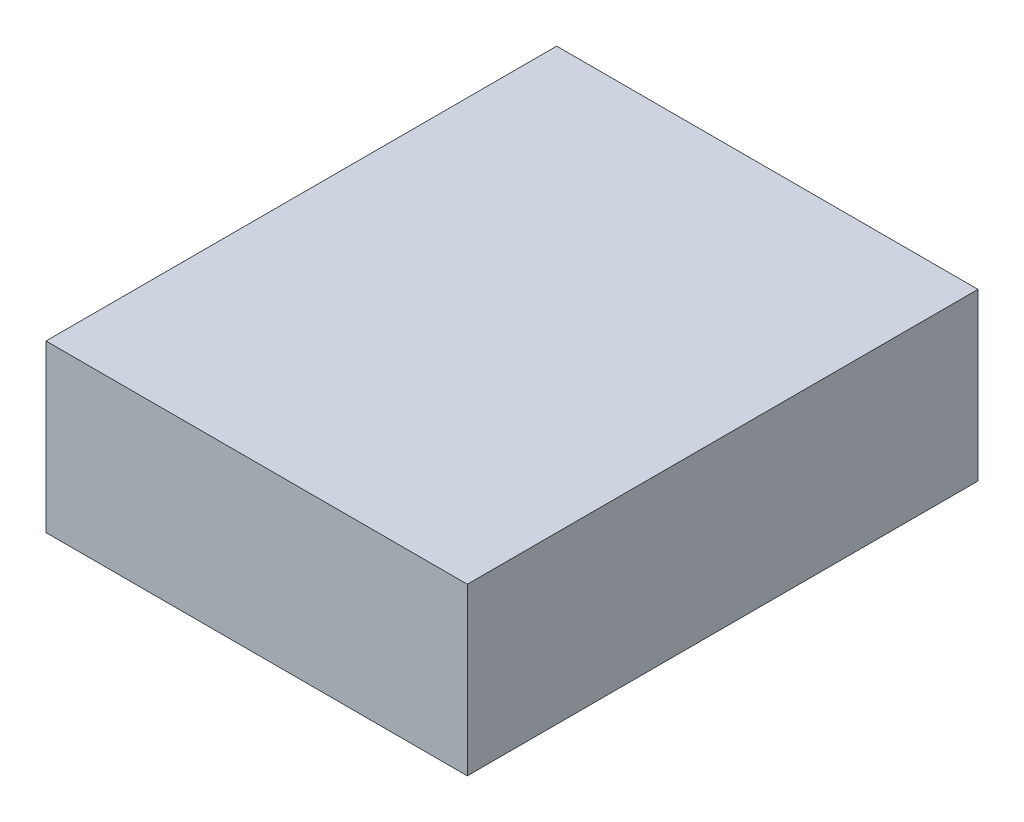
ISO-10303-21;
HEADER;
FILE_DESCRIPTION(('STEP AP214'),'2;1');
FILE_NAME('part.step','',(''),(''),'','','');
FILE_SCHEMA(('AUTOMOTIVE_DESIGN { 1 0 10303 214 1 1 1 1 }'));
ENDSEC;
DATA;
#1=APPLICATION_CONTEXT('core data for automotive mechanical design processes');
#2=APPLICATION_PROTOCOL_DEFINITION('international standard','automotive_design',2000,#1);
#3=PRODUCT_CONTEXT('',#1,'mechanical');
#4=PRODUCT('Part','Part','',(#3));
#5=PRODUCT_RELATED_PRODUCT_CATEGORY('part','',(#4));
#6=PRODUCT_DEFINITION_FORMATION('','',#4);
#7=PRODUCT_DEFINITION_CONTEXT('part definition',#1,'design');
#8=PRODUCT_DEFINITION('design','',#6,#7);
#9=PRODUCT_DEFINITION_SHAPE('','',#8);
#10=(LENGTH_UNIT() NAMED_UNIT(*) SI_UNIT(.MILLI.,.METRE.));
#11=(NAMED_UNIT(*) PLANE_ANGLE_UNIT() SI_UNIT($,.RADIAN.));
#12=(NAMED_UNIT(*) SI_UNIT($,.STERADIAN.) SOLID_ANGLE_UNIT());
#13=UNCERTAINTY_MEASURE_WITH_UNIT(LENGTH_MEASURE(1.E-05),#10,'distance_accuracy_value','');
#14=(GEOMETRIC_REPRESENTATION_CONTEXT(3) GLOBAL_UNCERTAINTY_ASSIGNED_CONTEXT((#13)) GLOBAL_UNIT_ASSIGNED_CONTEXT((#10,
#11,#12)) REPRESENTATION_CONTEXT('',''));
#15=CARTESIAN_POINT('',(0.,0.,0.));
#16=DIRECTION('',(0.,0.,1.));
#17=DIRECTION('',(1.,0.,0.));
#18=AXIS2_PLACEMENT_3D('',#15,#16,#17);
#19=CARTESIAN_POINT('',(3.3,-1.3,8.));
#20=DIRECTION('',(-1.,0.,0.));
#21=DIRECTION('',(0.,0.,1.));
#22=AXIS2_PLACEMENT_3D('',#19,#20,#21);
#23=PLANE('',#22);
#24=DIRECTION('',(0.,1.,0.));
#25=VECTOR('',#24,1.);
#26=CARTESIAN_POINT('',(3.3,-1.3,0.));
#27=LINE('',#26,#25);
#28=CARTESIAN_POINT('',(3.3,-1.3,0.));
#29=VERTEX_POINT('',#28);
#30=CARTESIAN_POINT('',(3.3,1.3,0.));
#31=VERTEX_POINT('',#30);
#32=EDGE_CURVE('E95',#29,#31,#27,.T.);
#33=ORIENTED_EDGE('',*,*,#32,.T.);
#34=DIRECTION('',(0.,0.,-1.));
#35=VECTOR('',#34,1.);
#36=CARTESIAN_POINT('',(3.3,1.3,8.));
#37=LINE('',#36,#35);
#38=CARTESIAN_POINT('',(3.3,1.3,8.));
#39=VERTEX_POINT('',#38);
#40=EDGE_CURVE('E11',#39,#31,#37,.T.);
#41=ORIENTED_EDGE('',*,*,#40,.F.);
#42=DIRECTION('',(0.,1.,0.));
#43=VECTOR('',#42,1.);
#44=CARTESIAN_POINT('',(3.3,-1.3,8.));
#45=LINE('',#44,#43);
#46=CARTESIAN_POINT('',(3.3,-1.3,8.));
#47=VERTEX_POINT('',#46);
#48=EDGE_CURVE('E83',#47,#39,#45,.T.);
#49=ORIENTED_EDGE('',*,*,#48,.F.);
#50=DIRECTION('',(0.,0.,-1.));
#51=VECTOR('',#50,1.);
#52=CARTESIAN_POINT('',(3.3,-1.3,8.));
#53=LINE('',#52,#51);
#54=EDGE_CURVE('E91',#47,#29,#53,.T.);
#55=ORIENTED_EDGE('',*,*,#54,.T.);
#56=EDGE_LOOP('',(#33,#41,#49,#55));
#57=FACE_BOUND('',#56,.T.);
#58=ADVANCED_FACE('F32',(#57),#23,.F.);
#59=CARTESIAN_POINT('',(-3.3,1.3,8.));
#60=DIRECTION('',(0.,-1.,0.));
#61=DIRECTION('',(0.,0.,-1.));
#62=AXIS2_PLACEMENT_3D('',#59,#60,#61);
#63=PLANE('',#62);
#64=DIRECTION('',(-1.,0.,0.));
#65=VECTOR('',#64,1.);
#66=CARTESIAN_POINT('',(-3.3,1.3,0.));
#67=LINE('',#66,#65);
#68=CARTESIAN_POINT('',(-3.3,1.3,0.));
#69=VERTEX_POINT('',#68);
#70=EDGE_CURVE('E87',#31,#69,#67,.T.);
#71=ORIENTED_EDGE('',*,*,#70,.T.);
#72=DIRECTION('',(0.,0.,-1.));
#73=VECTOR('',#72,1.);
#74=CARTESIAN_POINT('',(-3.3,1.3,8.));
#75=LINE('',#74,#73);
#76=CARTESIAN_POINT('',(-3.3,1.3,8.));
#77=VERTEX_POINT('',#76);
#78=EDGE_CURVE('E40',#77,#69,#75,.T.);
#79=ORIENTED_EDGE('',*,*,#78,.F.);
#80=DIRECTION('',(-1.,0.,0.));
#81=VECTOR('',#80,1.);
#82=CARTESIAN_POINT('',(-3.3,1.3,8.));
#83=LINE('',#82,#81);
#84=EDGE_CURVE('E78',#39,#77,#83,.T.);
#85=ORIENTED_EDGE('',*,*,#84,.F.);
#86=ORIENTED_EDGE('',*,*,#40,.T.);
#87=EDGE_LOOP('',(#71,#79,#85,#86));
#88=FACE_BOUND('',#87,.T.);
#89=ADVANCED_FACE('F86',(#88),#63,.F.);
#90=CARTESIAN_POINT('',(-3.3,-1.3,8.));
#91=DIRECTION('',(1.,0.,0.));
#92=DIRECTION('',(0.,0.,-1.));
#93=AXIS2_PLACEMENT_3D('',#90,#91,#92);
#94=PLANE('',#93);
#95=DIRECTION('',(0.,-1.,0.));
#96=VECTOR('',#95,1.);
#97=CARTESIAN_POINT('',(-3.3,-1.3,0.));
#98=LINE('',#97,#96);
#99=CARTESIAN_POINT('',(-3.3,-1.3,0.));
#100=VERTEX_POINT('',#99);
#101=EDGE_CURVE('E65',#69,#100,#98,.T.);
#102=ORIENTED_EDGE('',*,*,#101,.T.);
#103=DIRECTION('',(0.,0.,-1.));
#104=VECTOR('',#103,1.);
#105=CARTESIAN_POINT('',(-3.3,-1.3,8.));
#106=LINE('',#105,#104);
#107=CARTESIAN_POINT('',(-3.3,-1.3,8.));
#108=VERTEX_POINT('',#107);
#109=EDGE_CURVE('E88',#108,#100,#106,.T.);
#110=ORIENTED_EDGE('',*,*,#109,.F.);
#111=DIRECTION('',(0.,-1.,0.));
#112=VECTOR('',#111,1.);
#113=CARTESIAN_POINT('',(-3.3,-1.3,8.));
#114=LINE('',#113,#112);
#115=EDGE_CURVE('E81',#77,#108,#114,.T.);
#116=ORIENTED_EDGE('',*,*,#115,.F.);
#117=ORIENTED_EDGE('',*,*,#78,.T.);
#118=EDGE_LOOP('',(#102,#110,#116,#117));
#119=FACE_BOUND('',#118,.T.);
#120=ADVANCED_FACE('F89',(#119),#94,.F.);
#121=CARTESIAN_POINT('',(-3.3,-1.3,8.));
#122=DIRECTION('',(0.,1.,0.));
#123=DIRECTION('',(0.,0.,1.));
#124=AXIS2_PLACEMENT_3D('',#121,#122,#123);
#125=PLANE('',#124);
#126=DIRECTION('',(1.,0.,0.));
#127=VECTOR('',#126,1.);
#128=CARTESIAN_POINT('',(-3.3,-1.3,0.));
#129=LINE('',#128,#127);
#130=EDGE_CURVE('E71',#100,#29,#129,.T.);
#131=ORIENTED_EDGE('',*,*,#130,.T.);
#132=ORIENTED_EDGE('',*,*,#54,.F.);
#133=DIRECTION('',(1.,0.,0.));
#134=VECTOR('',#133,1.);
#135=CARTESIAN_POINT('',(-3.3,-1.3,8.));
#136=LINE('',#135,#134);
#137=EDGE_CURVE('E48',#108,#47,#136,.T.);
#138=ORIENTED_EDGE('',*,*,#137,.F.);
#139=ORIENTED_EDGE('',*,*,#109,.T.);
#140=EDGE_LOOP('',(#131,#132,#138,#139));
#141=FACE_BOUND('',#140,.T.);
#142=ADVANCED_FACE('F102',(#141),#125,.F.);
#143=CARTESIAN_POINT('',(0.,0.,8.));
#144=DIRECTION('',(0.,0.,-1.));
#145=DIRECTION('',(-1.,0.,0.));
#146=AXIS2_PLACEMENT_3D('',#143,#144,#145);
#147=PLANE('',#146);
#148=ORIENTED_EDGE('',*,*,#48,.T.);
#149=ORIENTED_EDGE('',*,*,#84,.T.);
#150=ORIENTED_EDGE('',*,*,#115,.T.);
#151=ORIENTED_EDGE('',*,*,#137,.T.);
#152=EDGE_LOOP('',(#148,#149,#150,#151));
#153=FACE_BOUND('',#152,.T.);
#154=ADVANCED_FACE('F79',(#153),#147,.F.);
#155=CARTESIAN_POINT('',(0.,0.,0.));
#156=DIRECTION('',(0.,0.,-1.));
#157=DIRECTION('',(-1.,0.,0.));
#158=AXIS2_PLACEMENT_3D('',#155,#156,#157);
#159=PLANE('',#158);
#160=ORIENTED_EDGE('',*,*,#32,.F.);
#161=ORIENTED_EDGE('',*,*,#130,.F.);
#162=ORIENTED_EDGE('',*,*,#101,.F.);
#163=ORIENTED_EDGE('',*,*,#70,.F.);
#164=EDGE_LOOP('',(#160,#161,#162,#163));
#165=FACE_BOUND('',#164,.T.);
#166=ADVANCED_FACE('F105',(#165),#159,.T.);
#167=CLOSED_SHELL('',(#58,#89,#120,#142,#154,#166));
#168=MANIFOLD_SOLID_BREP('B2',#167);
#169=ADVANCED_BREP_SHAPE_REPRESENTATION('',(#18,#168),#14);
#170=SHAPE_DEFINITION_REPRESENTATION(#9,#169);
ENDSEC;
END-ISO-10303-21;
